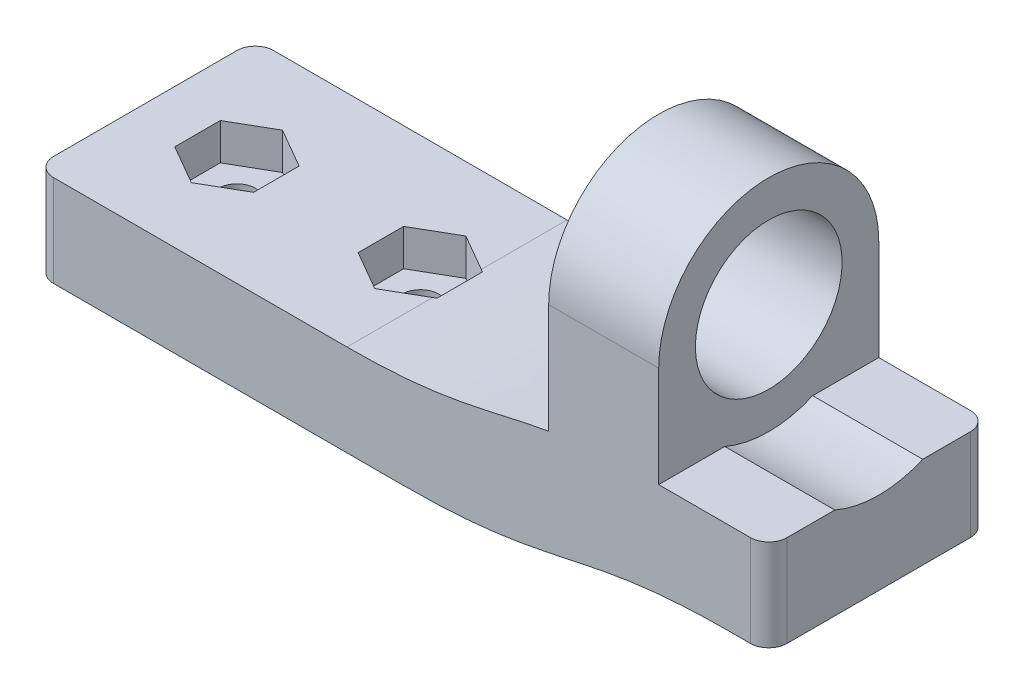
ISO-10303-21;
HEADER;
FILE_DESCRIPTION(('STEP AP214'),'2;1');
FILE_NAME('part.step','',(''),(''),'','','');
FILE_SCHEMA(('AUTOMOTIVE_DESIGN { 1 0 10303 214 1 1 1 1 }'));
ENDSEC;
DATA;
#1=APPLICATION_CONTEXT('core data for automotive mechanical design processes');
#2=APPLICATION_PROTOCOL_DEFINITION('international standard','automotive_design',2000,#1);
#3=PRODUCT_CONTEXT('',#1,'mechanical');
#4=PRODUCT('Part','Part','',(#3));
#5=PRODUCT_RELATED_PRODUCT_CATEGORY('part','',(#4));
#6=PRODUCT_DEFINITION_FORMATION('','',#4);
#7=PRODUCT_DEFINITION_CONTEXT('part definition',#1,'design');
#8=PRODUCT_DEFINITION('design','',#6,#7);
#9=PRODUCT_DEFINITION_SHAPE('','',#8);
#10=(LENGTH_UNIT() NAMED_UNIT(*) SI_UNIT(.MILLI.,.METRE.));
#11=(NAMED_UNIT(*) PLANE_ANGLE_UNIT() SI_UNIT($,.RADIAN.));
#12=(NAMED_UNIT(*) SI_UNIT($,.STERADIAN.) SOLID_ANGLE_UNIT());
#13=UNCERTAINTY_MEASURE_WITH_UNIT(LENGTH_MEASURE(1.E-05),#10,'distance_accuracy_value','');
#14=(GEOMETRIC_REPRESENTATION_CONTEXT(3) GLOBAL_UNCERTAINTY_ASSIGNED_CONTEXT((#13)) GLOBAL_UNIT_ASSIGNED_CONTEXT((#10,
#11,#12)) REPRESENTATION_CONTEXT('',''));
#15=CARTESIAN_POINT('',(0.,0.,0.));
#16=DIRECTION('',(0.,0.,1.));
#17=DIRECTION('',(1.,0.,0.));
#18=AXIS2_PLACEMENT_3D('',#15,#16,#17);
#19=CARTESIAN_POINT('',(0.,5.,12.));
#20=DIRECTION('',(0.,1.,0.));
#21=DIRECTION('',(0.,0.,1.));
#22=AXIS2_PLACEMENT_3D('',#19,#20,#21);
#23=PLANE('',#22);
#24=DIRECTION('',(0.,0.,-1.));
#25=VECTOR('',#24,1.);
#26=CARTESIAN_POINT('',(17.,5.,12.));
#27=LINE('',#26,#25);
#28=CARTESIAN_POINT('',(17.,5.,12.));
#29=VERTEX_POINT('',#28);
#30=CARTESIAN_POINT('',(17.,5.,7.32790561913614));
#31=VERTEX_POINT('',#30);
#32=EDGE_CURVE('E567',#29,#31,#27,.T.);
#33=ORIENTED_EDGE('',*,*,#32,.T.);
#34=DIRECTION('',(-0.866025403784439,0.,0.5));
#35=VECTOR('',#34,1.);
#36=CARTESIAN_POINT('',(2.22692378864669,5.,15.8571451465198));
#37=LINE('',#36,#35);
#38=CARTESIAN_POINT('',(15.,5.,8.48260615751539));
#39=VERTEX_POINT('',#38);
#40=EDGE_CURVE('E347',#31,#39,#37,.T.);
#41=ORIENTED_EDGE('',*,*,#40,.T.);
#42=DIRECTION('',(-0.866025403784439,0.,-0.5));
#43=VECTOR('',#42,1.);
#44=CARTESIAN_POINT('',(5.27307621135332,5.,2.86676408975326));
#45=LINE('',#44,#43);
#46=CARTESIAN_POINT('',(12.85,5.,7.2413030787577));
#47=VERTEX_POINT('',#46);
#48=EDGE_CURVE('E644',#39,#47,#45,.T.);
#49=ORIENTED_EDGE('',*,*,#48,.T.);
#50=DIRECTION('',(0.,0.,-1.));
#51=VECTOR('',#50,1.);
#52=CARTESIAN_POINT('',(12.85,5.,12.));
#53=LINE('',#52,#51);
#54=CARTESIAN_POINT('',(12.85,5.,4.7586969212423));
#55=VERTEX_POINT('',#54);
#56=EDGE_CURVE('E630',#47,#55,#53,.T.);
#57=ORIENTED_EDGE('',*,*,#56,.T.);
#58=DIRECTION('',(0.866025403784439,0.,-0.5));
#59=VECTOR('',#58,1.);
#60=CARTESIAN_POINT('',(0.0769237886466831,5.,12.1332359102467));
#61=LINE('',#60,#59);
#62=CARTESIAN_POINT('',(15.,5.,3.51739384248461));
#63=VERTEX_POINT('',#62);
#64=EDGE_CURVE('E416',#55,#63,#61,.T.);
#65=ORIENTED_EDGE('',*,*,#64,.T.);
#66=DIRECTION('',(0.866025403784439,0.,0.5));
#67=VECTOR('',#66,1.);
#68=CARTESIAN_POINT('',(7.42307621135331,5.,-0.857145146519829));
#69=LINE('',#68,#67);
#70=CARTESIAN_POINT('',(17.,5.,4.67209438086386));
#71=VERTEX_POINT('',#70);
#72=EDGE_CURVE('E344',#63,#71,#69,.T.);
#73=ORIENTED_EDGE('',*,*,#72,.T.);
#74=CARTESIAN_POINT('',(17.,5.,0.));
#75=VERTEX_POINT('',#74);
#76=EDGE_CURVE('E566',#71,#75,#27,.T.);
#77=ORIENTED_EDGE('',*,*,#76,.T.);
#78=DIRECTION('',(1.,0.,0.));
#79=VECTOR('',#78,1.);
#80=CARTESIAN_POINT('',(0.,5.,0.));
#81=LINE('',#80,#79);
#82=CARTESIAN_POINT('',(1.,5.,0.));
#83=VERTEX_POINT('',#82);
#84=EDGE_CURVE('E516',#83,#75,#81,.T.);
#85=ORIENTED_EDGE('',*,*,#84,.F.);
#86=CARTESIAN_POINT('',(1.,5.,1.));
#87=DIRECTION('',(0.,1.,0.));
#88=DIRECTION('',(0.,0.,1.));
#89=AXIS2_PLACEMENT_3D('',#86,#87,#88);
#90=CIRCLE('',#89,1.);
#91=CARTESIAN_POINT('',(0.,5.,1.));
#92=VERTEX_POINT('',#91);
#93=EDGE_CURVE('E583',#83,#92,#90,.T.);
#94=ORIENTED_EDGE('',*,*,#93,.T.);
#95=DIRECTION('',(0.,0.,-1.));
#96=VECTOR('',#95,1.);
#97=CARTESIAN_POINT('',(0.,5.,12.));
#98=LINE('',#97,#96);
#99=CARTESIAN_POINT('',(0.,5.,11.));
#100=VERTEX_POINT('',#99);
#101=EDGE_CURVE('E563',#100,#92,#98,.T.);
#102=ORIENTED_EDGE('',*,*,#101,.F.);
#103=CARTESIAN_POINT('',(1.,5.,11.));
#104=DIRECTION('',(0.,1.,0.));
#105=DIRECTION('',(0.,0.,1.));
#106=AXIS2_PLACEMENT_3D('',#103,#104,#105);
#107=CIRCLE('',#106,1.);
#108=CARTESIAN_POINT('',(1.,5.,12.));
#109=VERTEX_POINT('',#108);
#110=EDGE_CURVE('E585',#100,#109,#107,.T.);
#111=ORIENTED_EDGE('',*,*,#110,.T.);
#112=DIRECTION('',(1.,0.,0.));
#113=VECTOR('',#112,1.);
#114=CARTESIAN_POINT('',(0.,5.,12.));
#115=LINE('',#114,#113);
#116=EDGE_CURVE('E381',#109,#29,#115,.T.);
#117=ORIENTED_EDGE('',*,*,#116,.T.);
#118=EDGE_LOOP('',(#33,#41,#49,#57,#65,#73,#77,#85,#94,#102,#111,#117));
#119=FACE_BOUND('',#118,.T.);
#120=DIRECTION('',(0.866025403784439,0.,-0.5));
#121=VECTOR('',#120,1.);
#122=CARTESIAN_POINT('',(-2.42307621135332,5.,7.80310889132455));
#123=LINE('',#122,#121);
#124=CARTESIAN_POINT('',(2.84999999999999,5.,4.7586969212423));
#125=VERTEX_POINT('',#124);
#126=CARTESIAN_POINT('',(4.99999999999999,5.,3.51739384248461));
#127=VERTEX_POINT('',#126);
#128=EDGE_CURVE('E84',#125,#127,#123,.T.);
#129=ORIENTED_EDGE('',*,*,#128,.T.);
#130=DIRECTION('',(0.866025403784439,0.,0.5));
#131=VECTOR('',#130,1.);
#132=CARTESIAN_POINT('',(4.92307621135331,5.,3.47298187240236));
#133=LINE('',#132,#131);
#134=CARTESIAN_POINT('',(7.14999999999999,5.,4.7586969212423));
#135=VERTEX_POINT('',#134);
#136=EDGE_CURVE('E12',#127,#135,#133,.T.);
#137=ORIENTED_EDGE('',*,*,#136,.T.);
#138=DIRECTION('',(0.,0.,1.));
#139=VECTOR('',#138,1.);
#140=CARTESIAN_POINT('',(7.14999999999999,5.,12.));
#141=LINE('',#140,#139);
#142=CARTESIAN_POINT('',(7.14999999999999,5.,7.2413030787577));
#143=VERTEX_POINT('',#142);
#144=EDGE_CURVE('E645',#135,#143,#141,.T.);
#145=ORIENTED_EDGE('',*,*,#144,.T.);
#146=DIRECTION('',(-0.866025403784439,0.,0.5));
#147=VECTOR('',#146,1.);
#148=CARTESIAN_POINT('',(-0.273076211353319,5.,11.5270181275976));
#149=LINE('',#148,#147);
#150=CARTESIAN_POINT('',(4.99999999999999,5.,8.48260615751539));
#151=VERTEX_POINT('',#150);
#152=EDGE_CURVE('E652',#143,#151,#149,.T.);
#153=ORIENTED_EDGE('',*,*,#152,.T.);
#154=DIRECTION('',(-0.866025403784439,0.,-0.5));
#155=VECTOR('',#154,1.);
#156=CARTESIAN_POINT('',(2.77307621135331,5.,7.19689110867545));
#157=LINE('',#156,#155);
#158=CARTESIAN_POINT('',(2.84999999999999,5.,7.24130307875769));
#159=VERTEX_POINT('',#158);
#160=EDGE_CURVE('E655',#151,#159,#157,.T.);
#161=ORIENTED_EDGE('',*,*,#160,.T.);
#162=DIRECTION('',(0.,0.,-1.));
#163=VECTOR('',#162,1.);
#164=CARTESIAN_POINT('',(2.84999999999999,5.,12.));
#165=LINE('',#164,#163);
#166=EDGE_CURVE('E658',#159,#125,#165,.T.);
#167=ORIENTED_EDGE('',*,*,#166,.T.);
#168=EDGE_LOOP('',(#129,#137,#145,#153,#161,#167));
#169=FACE_BOUND('',#168,.T.);
#170=ADVANCED_FACE('F76',(#119,#169),#23,.T.);
#171=CARTESIAN_POINT('',(4.99999999999999,18.5,6.));
#172=DIRECTION('',(0.,-1.,0.));
#173=DIRECTION('',(0.,0.,-1.));
#174=AXIS2_PLACEMENT_3D('',#171,#172,#173);
#175=CYLINDRICAL_SURFACE('',#174,1.);
#176=CARTESIAN_POINT('',(4.99999999999999,0.,6.));
#177=DIRECTION('',(0.,1.,0.));
#178=DIRECTION('',(0.,0.,1.));
#179=AXIS2_PLACEMENT_3D('',#176,#177,#178);
#180=CIRCLE('',#179,1.);
#181=CARTESIAN_POINT('',(4.99999999999999,0.,7.));
#182=VERTEX_POINT('',#181);
#183=EDGE_CURVE('E359',#182,#182,#180,.T.);
#184=ORIENTED_EDGE('',*,*,#183,.F.);
#185=EDGE_LOOP('',(#184));
#186=FACE_BOUND('',#185,.T.);
#187=CARTESIAN_POINT('',(4.99999999999999,3.,6.));
#188=DIRECTION('',(0.,1.,0.));
#189=DIRECTION('',(0.,0.,1.));
#190=AXIS2_PLACEMENT_3D('',#187,#188,#189);
#191=CIRCLE('',#190,1.);
#192=CARTESIAN_POINT('',(4.99999999999999,3.,7.));
#193=VERTEX_POINT('',#192);
#194=EDGE_CURVE('E282',#193,#193,#191,.T.);
#195=ORIENTED_EDGE('',*,*,#194,.T.);
#196=EDGE_LOOP('',(#195));
#197=FACE_BOUND('',#196,.T.);
#198=ADVANCED_FACE('F394',(#186,#197),#175,.F.);
#199=CARTESIAN_POINT('',(17.,5.,12.));
#200=CARTESIAN_POINT('',(25.0493754757197,5.,12.));
#201=CARTESIAN_POINT('',(25.9184813701822,7.,12.));
#202=CARTESIAN_POINT('',(34.,7.,12.));
#203=B_SPLINE_CURVE_WITH_KNOTS('',3,(#199,#200,#201,#202),.UNSPECIFIED.,.F.,.F.,(4,4),(0.,1.),.UNSPECIFIED.);
#204=DIRECTION('',(0.,0.,-1.));
#205=VECTOR('',#204,1.);
#206=SURFACE_OF_LINEAR_EXTRUSION('',#203,#205);
#207=DIRECTION('',(0.,0.,-1.));
#208=VECTOR('',#207,1.);
#209=CARTESIAN_POINT('',(17.15,5.00023312428814,12.));
#210=LINE('',#209,#208);
#211=CARTESIAN_POINT('',(17.15,5.00023312428814,4.7586969212423));
#212=VERTEX_POINT('',#211);
#213=CARTESIAN_POINT('',(17.15,5.00023312428814,7.2413030787577));
#214=VERTEX_POINT('',#213);
#215=EDGE_CURVE('E417',#212,#214,#210,.F.);
#216=ORIENTED_EDGE('',*,*,#215,.T.);
#217=CARTESIAN_POINT('',(17.15,5.00023312428814,7.2413030787577));
#218=CARTESIAN_POINT('',(17.1250000454464,5.00015528123822,7.25573680924894));
#219=CARTESIAN_POINT('',(17.1000000681696,5.00009693268925,7.27017055285943));
#220=CARTESIAN_POINT('',(17.0500000681696,5.00001922459321,7.29903806631891));
#221=CARTESIAN_POINT('',(17.0250000454464,4.99999986504613,7.3134718361679));
#222=CARTESIAN_POINT('',(17.,5.,7.32790561913614));
#223=B_SPLINE_CURVE_WITH_KNOTS('',3,(#217,#218,#219,#220,#221,#222),.UNSPECIFIED.,.F.,.F.,(4,2,
4),(0.,0.0866026385686826,0.173205277137368),.UNSPECIFIED.);
#224=EDGE_CURVE('E409',#214,#31,#223,.T.);
#225=ORIENTED_EDGE('',*,*,#224,.T.);
#226=ORIENTED_EDGE('',*,*,#32,.F.);
#227=CARTESIAN_POINT('',(28.,6.51917525637421,12.));
#228=VERTEX_POINT('',#227);
#229=EDGE_CURVE('E375',#29,#228,#203,.T.);
#230=ORIENTED_EDGE('',*,*,#229,.T.);
#231=DIRECTION('',(0.,0.,-1.));
#232=VECTOR('',#231,1.);
#233=CARTESIAN_POINT('',(28.,6.51917525637421,12.));
#234=LINE('',#233,#232);
#235=CARTESIAN_POINT('',(28.,6.51917525637421,0.));
#236=VERTEX_POINT('',#235);
#237=EDGE_CURVE('E511',#228,#236,#234,.T.);
#238=ORIENTED_EDGE('',*,*,#237,.T.);
#239=CARTESIAN_POINT('',(17.,5.,0.));
#240=CARTESIAN_POINT('',(25.0493754757197,5.,0.));
#241=CARTESIAN_POINT('',(25.9184813701822,7.,0.));
#242=CARTESIAN_POINT('',(34.,7.,0.));
#243=B_SPLINE_CURVE_WITH_KNOTS('',3,(#239,#240,#241,#242),.UNSPECIFIED.,.F.,.F.,(4,4),(0.,1.),.UNSPECIFIED.);
#244=EDGE_CURVE('E374',#75,#236,#243,.T.);
#245=ORIENTED_EDGE('',*,*,#244,.F.);
#246=ORIENTED_EDGE('',*,*,#76,.F.);
#247=CARTESIAN_POINT('',(17.,5.,4.67209438086386));
#248=CARTESIAN_POINT('',(17.0250000454464,4.99999986504613,4.6865281638321));
#249=CARTESIAN_POINT('',(17.0500000681696,5.0000192245932,4.70096193368109));
#250=CARTESIAN_POINT('',(17.1000000681696,5.00009693268925,4.72982944714057));
#251=CARTESIAN_POINT('',(17.1250000454464,5.00015528123822,4.74426319075106));
#252=CARTESIAN_POINT('',(17.15,5.00023312428814,4.7586969212423));
#253=B_SPLINE_CURVE_WITH_KNOTS('',3,(#247,#248,#249,#250,#251,#252),.UNSPECIFIED.,.F.,.F.,(4,2,
4),(0.,0.0866026385686851,0.173205277137369),.UNSPECIFIED.);
#254=EDGE_CURVE('E401',#71,#212,#253,.T.);
#255=ORIENTED_EDGE('',*,*,#254,.T.);
#256=EDGE_LOOP('',(#216,#225,#226,#230,#238,#245,#246,#255));
#257=FACE_BOUND('',#256,.T.);
#258=ADVANCED_FACE('F388',(#257),#206,.T.);
#259=CARTESIAN_POINT('',(15.,18.5,6.));
#260=DIRECTION('',(0.,-1.,0.));
#261=DIRECTION('',(0.,0.,-1.));
#262=AXIS2_PLACEMENT_3D('',#259,#260,#261);
#263=CYLINDRICAL_SURFACE('',#262,1.);
#264=CARTESIAN_POINT('',(15.,0.,6.));
#265=DIRECTION('',(0.,1.,0.));
#266=DIRECTION('',(0.,0.,1.));
#267=AXIS2_PLACEMENT_3D('',#264,#265,#266);
#268=CIRCLE('',#267,1.);
#269=CARTESIAN_POINT('',(15.,0.,7.));
#270=VERTEX_POINT('',#269);
#271=EDGE_CURVE('E362',#270,#270,#268,.T.);
#272=ORIENTED_EDGE('',*,*,#271,.F.);
#273=EDGE_LOOP('',(#272));
#274=FACE_BOUND('',#273,.T.);
#275=CARTESIAN_POINT('',(15.,3.,6.));
#276=DIRECTION('',(0.,1.,0.));
#277=DIRECTION('',(0.,0.,1.));
#278=AXIS2_PLACEMENT_3D('',#275,#276,#277);
#279=CIRCLE('',#278,1.);
#280=CARTESIAN_POINT('',(15.,3.,7.));
#281=VERTEX_POINT('',#280);
#282=EDGE_CURVE('E343',#281,#281,#279,.T.);
#283=ORIENTED_EDGE('',*,*,#282,.T.);
#284=EDGE_LOOP('',(#283));
#285=FACE_BOUND('',#284,.T.);
#286=ADVANCED_FACE('F393',(#274,#285),#263,.F.);
#287=CARTESIAN_POINT('',(40.,0.,12.));
#288=DIRECTION('',(-1.,0.,0.));
#289=DIRECTION('',(0.,0.,1.));
#290=AXIS2_PLACEMENT_3D('',#287,#288,#289);
#291=PLANE('',#290);
#292=CARTESIAN_POINT('',(40.,12.5,6.));
#293=DIRECTION('',(-1.,0.,0.));
#294=DIRECTION('',(0.,0.,1.));
#295=AXIS2_PLACEMENT_3D('',#292,#293,#294);
#296=CIRCLE('',#295,6.00000000000001);
#297=CARTESIAN_POINT('',(40.,7.,8.39791576165632));
#298=VERTEX_POINT('',#297);
#299=CARTESIAN_POINT('',(40.,7.00000000000001,3.60208423834367));
#300=VERTEX_POINT('',#299);
#301=EDGE_CURVE('E355',#298,#300,#296,.F.);
#302=ORIENTED_EDGE('',*,*,#301,.F.);
#303=DIRECTION('',(0.,0.,-1.));
#304=VECTOR('',#303,1.);
#305=CARTESIAN_POINT('',(40.,7.,12.));
#306=LINE('',#305,#304);
#307=CARTESIAN_POINT('',(40.,7.,11.));
#308=VERTEX_POINT('',#307);
#309=EDGE_CURVE('E548',#308,#298,#306,.T.);
#310=ORIENTED_EDGE('',*,*,#309,.F.);
#311=DIRECTION('',(0.,1.,0.));
#312=VECTOR('',#311,1.);
#313=CARTESIAN_POINT('',(40.,2.,11.));
#314=LINE('',#313,#312);
#315=CARTESIAN_POINT('',(40.,2.,11.));
#316=VERTEX_POINT('',#315);
#317=EDGE_CURVE('E608',#308,#316,#314,.F.);
#318=ORIENTED_EDGE('',*,*,#317,.T.);
#319=DIRECTION('',(0.,0.,-1.));
#320=VECTOR('',#319,1.);
#321=CARTESIAN_POINT('',(40.,2.,12.));
#322=LINE('',#321,#320);
#323=CARTESIAN_POINT('',(40.,2.,1.));
#324=VERTEX_POINT('',#323);
#325=EDGE_CURVE('E551',#316,#324,#322,.T.);
#326=ORIENTED_EDGE('',*,*,#325,.T.);
#327=DIRECTION('',(0.,1.,0.));
#328=VECTOR('',#327,1.);
#329=CARTESIAN_POINT('',(40.,0.,1.));
#330=LINE('',#329,#328);
#331=CARTESIAN_POINT('',(40.,7.,1.));
#332=VERTEX_POINT('',#331);
#333=EDGE_CURVE('E605',#324,#332,#330,.T.);
#334=ORIENTED_EDGE('',*,*,#333,.T.);
#335=EDGE_CURVE('E547',#300,#332,#306,.T.);
#336=ORIENTED_EDGE('',*,*,#335,.F.);
#337=EDGE_LOOP('',(#302,#310,#318,#326,#334,#336));
#338=FACE_BOUND('',#337,.T.);
#339=ADVANCED_FACE('F447',(#338),#291,.F.);
#340=CARTESIAN_POINT('',(0.,6.99999999999999,12.));
#341=DIRECTION('',(0.,-1.,0.));
#342=DIRECTION('',(1.,0.,0.));
#343=AXIS2_PLACEMENT_3D('',#340,#341,#342);
#344=PLANE('',#343);
#345=DIRECTION('',(-1.,0.,0.));
#346=VECTOR('',#345,1.);
#347=CARTESIAN_POINT('',(44.,7.,8.39791576165633));
#348=LINE('',#347,#346);
#349=CARTESIAN_POINT('',(34.,7.,8.3979157616563));
#350=VERTEX_POINT('',#349);
#351=EDGE_CURVE('E357',#350,#298,#348,.F.);
#352=ORIENTED_EDGE('',*,*,#351,.F.);
#353=DIRECTION('',(0.,0.,-1.));
#354=VECTOR('',#353,1.);
#355=CARTESIAN_POINT('',(34.,7.,12.));
#356=LINE('',#355,#354);
#357=CARTESIAN_POINT('',(34.,7.,12.));
#358=VERTEX_POINT('',#357);
#359=EDGE_CURVE('E544',#358,#350,#356,.T.);
#360=ORIENTED_EDGE('',*,*,#359,.F.);
#361=DIRECTION('',(-1.,0.,0.));
#362=VECTOR('',#361,1.);
#363=CARTESIAN_POINT('',(0.,6.99999999999999,12.));
#364=LINE('',#363,#362);
#365=CARTESIAN_POINT('',(39.,7.,12.));
#366=VERTEX_POINT('',#365);
#367=EDGE_CURVE('E504',#366,#358,#364,.T.);
#368=ORIENTED_EDGE('',*,*,#367,.F.);
#369=CARTESIAN_POINT('',(39.,7.,11.));
#370=DIRECTION('',(0.,-1.,0.));
#371=DIRECTION('',(1.,0.,0.));
#372=AXIS2_PLACEMENT_3D('',#369,#370,#371);
#373=CIRCLE('',#372,1.);
#374=EDGE_CURVE('E603',#366,#308,#373,.F.);
#375=ORIENTED_EDGE('',*,*,#374,.T.);
#376=ORIENTED_EDGE('',*,*,#309,.T.);
#377=EDGE_LOOP('',(#352,#360,#368,#375,#376));
#378=FACE_BOUND('',#377,.T.);
#379=ADVANCED_FACE('F476',(#378),#344,.F.);
#380=DIRECTION('',(-1.,0.,0.));
#381=VECTOR('',#380,1.);
#382=CARTESIAN_POINT('',(44.,7.,3.60208423834367));
#383=LINE('',#382,#381);
#384=CARTESIAN_POINT('',(34.,7.,3.6020842383437));
#385=VERTEX_POINT('',#384);
#386=EDGE_CURVE('E352',#300,#385,#383,.T.);
#387=ORIENTED_EDGE('',*,*,#386,.F.);
#388=ORIENTED_EDGE('',*,*,#335,.T.);
#389=CARTESIAN_POINT('',(39.,7.,1.));
#390=DIRECTION('',(0.,-1.,0.));
#391=DIRECTION('',(1.,0.,0.));
#392=AXIS2_PLACEMENT_3D('',#389,#390,#391);
#393=CIRCLE('',#392,1.);
#394=CARTESIAN_POINT('',(39.,7.,0.));
#395=VERTEX_POINT('',#394);
#396=EDGE_CURVE('E601',#332,#395,#393,.F.);
#397=ORIENTED_EDGE('',*,*,#396,.T.);
#398=DIRECTION('',(-1.,0.,0.));
#399=VECTOR('',#398,1.);
#400=CARTESIAN_POINT('',(0.,6.99999999999999,0.));
#401=LINE('',#400,#399);
#402=CARTESIAN_POINT('',(34.,7.,0.));
#403=VERTEX_POINT('',#402);
#404=EDGE_CURVE('E534',#395,#403,#401,.T.);
#405=ORIENTED_EDGE('',*,*,#404,.T.);
#406=EDGE_CURVE('E543',#385,#403,#356,.T.);
#407=ORIENTED_EDGE('',*,*,#406,.F.);
#408=EDGE_LOOP('',(#387,#388,#397,#405,#407));
#409=FACE_BOUND('',#408,.T.);
#410=ADVANCED_FACE('F479',(#409),#344,.F.);
#411=CARTESIAN_POINT('',(0.,0.,12.));
#412=DIRECTION('',(0.,1.,0.));
#413=DIRECTION('',(0.,0.,1.));
#414=AXIS2_PLACEMENT_3D('',#411,#412,#413);
#415=PLANE('',#414);
#416=ORIENTED_EDGE('',*,*,#271,.T.);
#417=EDGE_LOOP('',(#416));
#418=FACE_BOUND('',#417,.T.);
#419=DIRECTION('',(1.,0.,0.));
#420=VECTOR('',#419,1.);
#421=CARTESIAN_POINT('',(0.,0.,12.));
#422=LINE('',#421,#420);
#423=CARTESIAN_POINT('',(1.,0.,12.));
#424=VERTEX_POINT('',#423);
#425=CARTESIAN_POINT('',(20.,0.,12.));
#426=VERTEX_POINT('',#425);
#427=EDGE_CURVE('E499',#424,#426,#422,.T.);
#428=ORIENTED_EDGE('',*,*,#427,.F.);
#429=CARTESIAN_POINT('',(1.,0.,11.));
#430=DIRECTION('',(0.,1.,0.));
#431=DIRECTION('',(0.,0.,1.));
#432=AXIS2_PLACEMENT_3D('',#429,#430,#431);
#433=CIRCLE('',#432,1.);
#434=CARTESIAN_POINT('',(0.,0.,11.));
#435=VERTEX_POINT('',#434);
#436=EDGE_CURVE('E594',#424,#435,#433,.F.);
#437=ORIENTED_EDGE('',*,*,#436,.T.);
#438=DIRECTION('',(0.,0.,-1.));
#439=VECTOR('',#438,1.);
#440=CARTESIAN_POINT('',(0.,0.,12.));
#441=LINE('',#440,#439);
#442=CARTESIAN_POINT('',(0.,0.,1.));
#443=VERTEX_POINT('',#442);
#444=EDGE_CURVE('E560',#435,#443,#441,.T.);
#445=ORIENTED_EDGE('',*,*,#444,.T.);
#446=CARTESIAN_POINT('',(1.,0.,1.));
#447=DIRECTION('',(0.,1.,0.));
#448=DIRECTION('',(0.,0.,1.));
#449=AXIS2_PLACEMENT_3D('',#446,#447,#448);
#450=CIRCLE('',#449,1.);
#451=CARTESIAN_POINT('',(1.,0.,0.));
#452=VERTEX_POINT('',#451);
#453=EDGE_CURVE('E592',#443,#452,#450,.F.);
#454=ORIENTED_EDGE('',*,*,#453,.T.);
#455=DIRECTION('',(1.,0.,0.));
#456=VECTOR('',#455,1.);
#457=CARTESIAN_POINT('',(0.,0.,0.));
#458=LINE('',#457,#456);
#459=CARTESIAN_POINT('',(20.,0.,0.));
#460=VERTEX_POINT('',#459);
#461=EDGE_CURVE('E522',#452,#460,#458,.T.);
#462=ORIENTED_EDGE('',*,*,#461,.T.);
#463=DIRECTION('',(0.,0.,-1.));
#464=VECTOR('',#463,1.);
#465=CARTESIAN_POINT('',(20.,0.,12.));
#466=LINE('',#465,#464);
#467=EDGE_CURVE('E557',#426,#460,#466,.T.);
#468=ORIENTED_EDGE('',*,*,#467,.F.);
#469=EDGE_LOOP('',(#428,#437,#445,#454,#462,#468));
#470=FACE_BOUND('',#469,.T.);
#471=ORIENTED_EDGE('',*,*,#183,.T.);
#472=EDGE_LOOP('',(#471));
#473=FACE_BOUND('',#472,.T.);
#474=ADVANCED_FACE('F474',(#418,#470,#473),#415,.F.);
#475=CARTESIAN_POINT('',(34.,0.,12.));
#476=DIRECTION('',(-1.,0.,0.));
#477=DIRECTION('',(0.,0.,1.));
#478=AXIS2_PLACEMENT_3D('',#475,#476,#477);
#479=PLANE('',#478);
#480=CARTESIAN_POINT('',(34.,12.5,6.));
#481=DIRECTION('',(-1.,0.,0.));
#482=DIRECTION('',(0.,0.,1.));
#483=AXIS2_PLACEMENT_3D('',#480,#481,#482);
#484=CIRCLE('',#483,6.);
#485=CARTESIAN_POINT('',(34.,12.5,0.));
#486=VERTEX_POINT('',#485);
#487=CARTESIAN_POINT('',(34.,12.5,12.));
#488=VERTEX_POINT('',#487);
#489=EDGE_CURVE('E372',#486,#488,#484,.F.);
#490=ORIENTED_EDGE('',*,*,#489,.T.);
#491=DIRECTION('',(0.,1.,0.));
#492=VECTOR('',#491,1.);
#493=CARTESIAN_POINT('',(34.,0.,12.));
#494=LINE('',#493,#492);
#495=EDGE_CURVE('E506',#358,#488,#494,.T.);
#496=ORIENTED_EDGE('',*,*,#495,.F.);
#497=ORIENTED_EDGE('',*,*,#359,.T.);
#498=CARTESIAN_POINT('',(34.,12.5,6.));
#499=DIRECTION('',(1.,0.,0.));
#500=DIRECTION('',(0.,1.,0.));
#501=AXIS2_PLACEMENT_3D('',#498,#499,#500);
#502=CIRCLE('',#501,6.00000000000001);
#503=EDGE_CURVE('E350',#350,#385,#502,.T.);
#504=ORIENTED_EDGE('',*,*,#503,.T.);
#505=ORIENTED_EDGE('',*,*,#406,.T.);
#506=DIRECTION('',(0.,1.,0.));
#507=VECTOR('',#506,1.);
#508=CARTESIAN_POINT('',(34.,0.,0.));
#509=LINE('',#508,#507);
#510=EDGE_CURVE('E537',#403,#486,#509,.T.);
#511=ORIENTED_EDGE('',*,*,#510,.T.);
#512=EDGE_LOOP('',(#490,#496,#497,#504,#505,#511));
#513=FACE_BOUND('',#512,.T.);
#514=CARTESIAN_POINT('',(34.,12.5,6.));
#515=DIRECTION('',(-1.,0.,0.));
#516=DIRECTION('',(0.,0.,1.));
#517=AXIS2_PLACEMENT_3D('',#514,#515,#516);
#518=CIRCLE('',#517,4.);
#519=CARTESIAN_POINT('',(34.,12.5,10.));
#520=VERTEX_POINT('',#519);
#521=EDGE_CURVE('E366',#520,#520,#518,.F.);
#522=ORIENTED_EDGE('',*,*,#521,.F.);
#523=EDGE_LOOP('',(#522));
#524=FACE_BOUND('',#523,.T.);
#525=ADVANCED_FACE('F470',(#513,#524),#479,.F.);
#526=CARTESIAN_POINT('',(28.,0.,12.));
#527=DIRECTION('',(1.,0.,0.));
#528=DIRECTION('',(0.,1.,0.));
#529=AXIS2_PLACEMENT_3D('',#526,#527,#528);
#530=PLANE('',#529);
#531=DIRECTION('',(0.,-1.,0.));
#532=VECTOR('',#531,1.);
#533=CARTESIAN_POINT('',(28.,0.,12.));
#534=LINE('',#533,#532);
#535=CARTESIAN_POINT('',(28.,12.5,12.));
#536=VERTEX_POINT('',#535);
#537=EDGE_CURVE('E509',#536,#228,#534,.T.);
#538=ORIENTED_EDGE('',*,*,#537,.F.);
#539=CARTESIAN_POINT('',(28.,12.5,6.));
#540=DIRECTION('',(1.,0.,0.));
#541=DIRECTION('',(0.,1.,0.));
#542=AXIS2_PLACEMENT_3D('',#539,#540,#541);
#543=CIRCLE('',#542,6.);
#544=CARTESIAN_POINT('',(28.,12.5,0.));
#545=VERTEX_POINT('',#544);
#546=EDGE_CURVE('E369',#536,#545,#543,.F.);
#547=ORIENTED_EDGE('',*,*,#546,.T.);
#548=DIRECTION('',(0.,-1.,0.));
#549=VECTOR('',#548,1.);
#550=CARTESIAN_POINT('',(28.,0.,0.));
#551=LINE('',#550,#549);
#552=EDGE_CURVE('E382',#545,#236,#551,.T.);
#553=ORIENTED_EDGE('',*,*,#552,.T.);
#554=ORIENTED_EDGE('',*,*,#237,.F.);
#555=EDGE_LOOP('',(#538,#547,#553,#554));
#556=FACE_BOUND('',#555,.T.);
#557=CARTESIAN_POINT('',(28.,12.5,6.));
#558=DIRECTION('',(1.,0.,0.));
#559=DIRECTION('',(0.,1.,0.));
#560=AXIS2_PLACEMENT_3D('',#557,#558,#559);
#561=CIRCLE('',#560,4.);
#562=CARTESIAN_POINT('',(28.,16.5,6.));
#563=VERTEX_POINT('',#562);
#564=EDGE_CURVE('E365',#563,#563,#561,.F.);
#565=ORIENTED_EDGE('',*,*,#564,.F.);
#566=EDGE_LOOP('',(#565));
#567=FACE_BOUND('',#566,.T.);
#568=ADVANCED_FACE('F466',(#556,#567),#530,.F.);
#569=CARTESIAN_POINT('',(0.,0.,12.));
#570=DIRECTION('',(-1.,0.,0.));
#571=DIRECTION('',(0.,0.,1.));
#572=AXIS2_PLACEMENT_3D('',#569,#570,#571);
#573=PLANE('',#572);
#574=ORIENTED_EDGE('',*,*,#444,.F.);
#575=DIRECTION('',(0.,1.,0.));
#576=VECTOR('',#575,1.);
#577=CARTESIAN_POINT('',(0.,0.,11.));
#578=LINE('',#577,#576);
#579=EDGE_CURVE('E580',#435,#100,#578,.T.);
#580=ORIENTED_EDGE('',*,*,#579,.T.);
#581=ORIENTED_EDGE('',*,*,#101,.T.);
#582=DIRECTION('',(0.,1.,0.));
#583=VECTOR('',#582,1.);
#584=CARTESIAN_POINT('',(0.,0.,1.));
#585=LINE('',#584,#583);
#586=EDGE_CURVE('E576',#92,#443,#585,.F.);
#587=ORIENTED_EDGE('',*,*,#586,.T.);
#588=EDGE_LOOP('',(#574,#580,#581,#587));
#589=FACE_BOUND('',#588,.T.);
#590=ADVANCED_FACE('F469',(#589),#573,.T.);
#591=CARTESIAN_POINT('',(20.,0.,12.));
#592=CARTESIAN_POINT('',(28.689683172901,0.,12.));
#593=CARTESIAN_POINT('',(29.3401982415742,2.,12.));
#594=CARTESIAN_POINT('',(38.,2.,12.));
#595=B_SPLINE_CURVE_WITH_KNOTS('',3,(#591,#592,#593,#594),.UNSPECIFIED.,.F.,.F.,(4,4),(0.,1.),.UNSPECIFIED.);
#596=DIRECTION('',(0.,0.,-1.));
#597=VECTOR('',#596,1.);
#598=SURFACE_OF_LINEAR_EXTRUSION('',#595,#597);
#599=CARTESIAN_POINT('',(20.,0.,0.));
#600=CARTESIAN_POINT('',(28.689683172901,0.,0.));
#601=CARTESIAN_POINT('',(29.3401982415742,2.,0.));
#602=CARTESIAN_POINT('',(38.,2.,0.));
#603=B_SPLINE_CURVE_WITH_KNOTS('',3,(#599,#600,#601,#602),.UNSPECIFIED.,.F.,.F.,(4,4),(0.,1.),.UNSPECIFIED.);
#604=CARTESIAN_POINT('',(38.,2.,0.));
#605=VERTEX_POINT('',#604);
#606=EDGE_CURVE('E524',#460,#605,#603,.T.);
#607=ORIENTED_EDGE('',*,*,#606,.T.);
#608=DIRECTION('',(0.,0.,-1.));
#609=VECTOR('',#608,1.);
#610=CARTESIAN_POINT('',(38.,2.,12.));
#611=LINE('',#610,#609);
#612=CARTESIAN_POINT('',(38.,2.,12.));
#613=VERTEX_POINT('',#612);
#614=EDGE_CURVE('E554',#613,#605,#611,.T.);
#615=ORIENTED_EDGE('',*,*,#614,.F.);
#616=EDGE_CURVE('E492',#426,#613,#595,.T.);
#617=ORIENTED_EDGE('',*,*,#616,.F.);
#618=ORIENTED_EDGE('',*,*,#467,.T.);
#619=EDGE_LOOP('',(#607,#615,#617,#618));
#620=FACE_BOUND('',#619,.T.);
#621=ADVANCED_FACE('F486',(#620),#598,.F.);
#622=CARTESIAN_POINT('',(0.,1.99999999999999,12.));
#623=DIRECTION('',(0.,-1.,0.));
#624=DIRECTION('',(1.,0.,0.));
#625=AXIS2_PLACEMENT_3D('',#622,#623,#624);
#626=PLANE('',#625);
#627=ORIENTED_EDGE('',*,*,#325,.F.);
#628=CARTESIAN_POINT('',(39.,2.,11.));
#629=DIRECTION('',(0.,-1.,0.));
#630=DIRECTION('',(1.,0.,0.));
#631=AXIS2_PLACEMENT_3D('',#628,#629,#630);
#632=CIRCLE('',#631,1.);
#633=CARTESIAN_POINT('',(39.,2.,12.));
#634=VERTEX_POINT('',#633);
#635=EDGE_CURVE('E612',#316,#634,#632,.T.);
#636=ORIENTED_EDGE('',*,*,#635,.T.);
#637=DIRECTION('',(-1.,0.,0.));
#638=VECTOR('',#637,1.);
#639=CARTESIAN_POINT('',(0.,1.99999999999999,12.));
#640=LINE('',#639,#638);
#641=EDGE_CURVE('E498',#634,#613,#640,.T.);
#642=ORIENTED_EDGE('',*,*,#641,.T.);
#643=ORIENTED_EDGE('',*,*,#614,.T.);
#644=DIRECTION('',(-1.,0.,0.));
#645=VECTOR('',#644,1.);
#646=CARTESIAN_POINT('',(0.,1.99999999999999,0.));
#647=LINE('',#646,#645);
#648=CARTESIAN_POINT('',(39.,2.,0.));
#649=VERTEX_POINT('',#648);
#650=EDGE_CURVE('E529',#649,#605,#647,.T.);
#651=ORIENTED_EDGE('',*,*,#650,.F.);
#652=CARTESIAN_POINT('',(39.,2.,1.));
#653=DIRECTION('',(0.,-1.,0.));
#654=DIRECTION('',(1.,0.,0.));
#655=AXIS2_PLACEMENT_3D('',#652,#653,#654);
#656=CIRCLE('',#655,1.);
#657=EDGE_CURVE('E610',#649,#324,#656,.T.);
#658=ORIENTED_EDGE('',*,*,#657,.T.);
#659=EDGE_LOOP('',(#627,#636,#642,#643,#651,#658));
#660=FACE_BOUND('',#659,.T.);
#661=ADVANCED_FACE('F461',(#660),#626,.T.);
#662=CARTESIAN_POINT('',(0.,0.,12.));
#663=DIRECTION('',(0.,0.,1.));
#664=DIRECTION('',(1.,0.,0.));
#665=AXIS2_PLACEMENT_3D('',#662,#663,#664);
#666=PLANE('',#665);
#667=ORIENTED_EDGE('',*,*,#116,.F.);
#668=DIRECTION('',(0.,1.,0.));
#669=VECTOR('',#668,1.);
#670=CARTESIAN_POINT('',(1.,0.,12.));
#671=LINE('',#670,#669);
#672=EDGE_CURVE('E590',#109,#424,#671,.F.);
#673=ORIENTED_EDGE('',*,*,#672,.T.);
#674=ORIENTED_EDGE('',*,*,#427,.T.);
#675=ORIENTED_EDGE('',*,*,#616,.T.);
#676=ORIENTED_EDGE('',*,*,#641,.F.);
#677=DIRECTION('',(0.,1.,0.));
#678=VECTOR('',#677,1.);
#679=CARTESIAN_POINT('',(39.,7.,12.));
#680=LINE('',#679,#678);
#681=EDGE_CURVE('E587',#634,#366,#680,.T.);
#682=ORIENTED_EDGE('',*,*,#681,.T.);
#683=ORIENTED_EDGE('',*,*,#367,.T.);
#684=ORIENTED_EDGE('',*,*,#495,.T.);
#685=DIRECTION('',(-1.,0.,0.));
#686=VECTOR('',#685,1.);
#687=CARTESIAN_POINT('',(40.,12.5,12.));
#688=LINE('',#687,#686);
#689=EDGE_CURVE('E573',#536,#488,#688,.F.);
#690=ORIENTED_EDGE('',*,*,#689,.F.);
#691=ORIENTED_EDGE('',*,*,#537,.T.);
#692=ORIENTED_EDGE('',*,*,#229,.F.);
#693=EDGE_LOOP('',(#667,#673,#674,#675,#676,#682,#683,#684,#690,#691,#692));
#694=FACE_BOUND('',#693,.T.);
#695=ADVANCED_FACE('F458',(#694),#666,.T.);
#696=CARTESIAN_POINT('',(0.,0.,0.));
#697=DIRECTION('',(0.,0.,1.));
#698=DIRECTION('',(1.,0.,0.));
#699=AXIS2_PLACEMENT_3D('',#696,#697,#698);
#700=PLANE('',#699);
#701=ORIENTED_EDGE('',*,*,#461,.F.);
#702=DIRECTION('',(0.,1.,0.));
#703=VECTOR('',#702,1.);
#704=CARTESIAN_POINT('',(1.,5.,0.));
#705=LINE('',#704,#703);
#706=EDGE_CURVE('E598',#452,#83,#705,.T.);
#707=ORIENTED_EDGE('',*,*,#706,.T.);
#708=ORIENTED_EDGE('',*,*,#84,.T.);
#709=ORIENTED_EDGE('',*,*,#244,.T.);
#710=ORIENTED_EDGE('',*,*,#552,.F.);
#711=DIRECTION('',(-1.,0.,0.));
#712=VECTOR('',#711,1.);
#713=CARTESIAN_POINT('',(40.,12.5,0.));
#714=LINE('',#713,#712);
#715=EDGE_CURVE('E570',#545,#486,#714,.F.);
#716=ORIENTED_EDGE('',*,*,#715,.T.);
#717=ORIENTED_EDGE('',*,*,#510,.F.);
#718=ORIENTED_EDGE('',*,*,#404,.F.);
#719=DIRECTION('',(0.,1.,0.));
#720=VECTOR('',#719,1.);
#721=CARTESIAN_POINT('',(39.,0.,0.));
#722=LINE('',#721,#720);
#723=EDGE_CURVE('E596',#395,#649,#722,.F.);
#724=ORIENTED_EDGE('',*,*,#723,.T.);
#725=ORIENTED_EDGE('',*,*,#650,.T.);
#726=ORIENTED_EDGE('',*,*,#606,.F.);
#727=EDGE_LOOP('',(#701,#707,#708,#709,#710,#716,#717,#718,#724,#725,#726));
#728=FACE_BOUND('',#727,.T.);
#729=ADVANCED_FACE('F456',(#728),#700,.F.);
#730=CARTESIAN_POINT('',(40.,12.5,6.));
#731=DIRECTION('',(-1.,0.,0.));
#732=DIRECTION('',(0.,0.,1.));
#733=AXIS2_PLACEMENT_3D('',#730,#731,#732);
#734=CYLINDRICAL_SURFACE('',#733,6.);
#735=ORIENTED_EDGE('',*,*,#715,.F.);
#736=ORIENTED_EDGE('',*,*,#546,.F.);
#737=ORIENTED_EDGE('',*,*,#689,.T.);
#738=ORIENTED_EDGE('',*,*,#489,.F.);
#739=EDGE_LOOP('',(#735,#736,#737,#738));
#740=FACE_BOUND('',#739,.T.);
#741=ADVANCED_FACE('F452',(#740),#734,.T.);
#742=CARTESIAN_POINT('',(40.,12.5,6.));
#743=DIRECTION('',(-1.,0.,0.));
#744=DIRECTION('',(0.,0.,1.));
#745=AXIS2_PLACEMENT_3D('',#742,#743,#744);
#746=CYLINDRICAL_SURFACE('',#745,4.);
#747=ORIENTED_EDGE('',*,*,#564,.T.);
#748=EDGE_LOOP('',(#747));
#749=FACE_BOUND('',#748,.T.);
#750=ORIENTED_EDGE('',*,*,#521,.T.);
#751=EDGE_LOOP('',(#750));
#752=FACE_BOUND('',#751,.T.);
#753=ADVANCED_FACE('F449',(#749,#752),#746,.F.);
#754=CARTESIAN_POINT('',(1.,0.,11.));
#755=DIRECTION('',(0.,1.,0.));
#756=DIRECTION('',(0.,0.,1.));
#757=AXIS2_PLACEMENT_3D('',#754,#755,#756);
#758=CYLINDRICAL_SURFACE('',#757,1.);
#759=ORIENTED_EDGE('',*,*,#436,.F.);
#760=ORIENTED_EDGE('',*,*,#672,.F.);
#761=ORIENTED_EDGE('',*,*,#110,.F.);
#762=ORIENTED_EDGE('',*,*,#579,.F.);
#763=EDGE_LOOP('',(#759,#760,#761,#762));
#764=FACE_BOUND('',#763,.T.);
#765=ADVANCED_FACE('F397',(#764),#758,.T.);
#766=CARTESIAN_POINT('',(1.,0.,1.));
#767=DIRECTION('',(0.,-1.,0.));
#768=DIRECTION('',(0.,0.,-1.));
#769=AXIS2_PLACEMENT_3D('',#766,#767,#768);
#770=CYLINDRICAL_SURFACE('',#769,1.);
#771=ORIENTED_EDGE('',*,*,#453,.F.);
#772=ORIENTED_EDGE('',*,*,#586,.F.);
#773=ORIENTED_EDGE('',*,*,#93,.F.);
#774=ORIENTED_EDGE('',*,*,#706,.F.);
#775=EDGE_LOOP('',(#771,#772,#773,#774));
#776=FACE_BOUND('',#775,.T.);
#777=ADVANCED_FACE('F762',(#776),#770,.T.);
#778=CARTESIAN_POINT('',(39.,0.,11.));
#779=DIRECTION('',(0.,-1.,0.));
#780=DIRECTION('',(0.,0.,-1.));
#781=AXIS2_PLACEMENT_3D('',#778,#779,#780);
#782=CYLINDRICAL_SURFACE('',#781,1.);
#783=ORIENTED_EDGE('',*,*,#635,.F.);
#784=ORIENTED_EDGE('',*,*,#317,.F.);
#785=ORIENTED_EDGE('',*,*,#374,.F.);
#786=ORIENTED_EDGE('',*,*,#681,.F.);
#787=EDGE_LOOP('',(#783,#784,#785,#786));
#788=FACE_BOUND('',#787,.T.);
#789=ADVANCED_FACE('F769',(#788),#782,.T.);
#790=CARTESIAN_POINT('',(39.,0.,1.));
#791=DIRECTION('',(0.,1.,0.));
#792=DIRECTION('',(0.,0.,1.));
#793=AXIS2_PLACEMENT_3D('',#790,#791,#792);
#794=CYLINDRICAL_SURFACE('',#793,1.);
#795=ORIENTED_EDGE('',*,*,#657,.F.);
#796=ORIENTED_EDGE('',*,*,#723,.F.);
#797=ORIENTED_EDGE('',*,*,#396,.F.);
#798=ORIENTED_EDGE('',*,*,#333,.F.);
#799=EDGE_LOOP('',(#795,#796,#797,#798));
#800=FACE_BOUND('',#799,.T.);
#801=ADVANCED_FACE('F78',(#800),#794,.T.);
#802=CARTESIAN_POINT('',(44.,12.5,6.));
#803=DIRECTION('',(-1.,0.,0.));
#804=DIRECTION('',(0.,-1.,0.));
#805=AXIS2_PLACEMENT_3D('',#802,#803,#804);
#806=CYLINDRICAL_SURFACE('',#805,6.00000000000001);
#807=ORIENTED_EDGE('',*,*,#351,.T.);
#808=ORIENTED_EDGE('',*,*,#301,.T.);
#809=ORIENTED_EDGE('',*,*,#386,.T.);
#810=ORIENTED_EDGE('',*,*,#503,.F.);
#811=EDGE_LOOP('',(#807,#808,#809,#810));
#812=FACE_BOUND('',#811,.T.);
#813=ADVANCED_FACE('F437',(#812),#806,.F.);
#814=CARTESIAN_POINT('',(15.,6.,3.51739384248461));
#815=DIRECTION('',(0.5,0.,0.866025403784439));
#816=DIRECTION('',(0.866025403784439,0.,-0.5));
#817=AXIS2_PLACEMENT_3D('',#814,#815,#816);
#818=PLANE('',#817);
#819=DIRECTION('',(0.,-1.,0.));
#820=VECTOR('',#819,1.);
#821=CARTESIAN_POINT('',(12.85,6.,4.7586969212423));
#822=LINE('',#821,#820);
#823=CARTESIAN_POINT('',(12.85,3.,4.7586969212423));
#824=VERTEX_POINT('',#823);
#825=EDGE_CURVE('E341',#55,#824,#822,.T.);
#826=ORIENTED_EDGE('',*,*,#825,.T.);
#827=DIRECTION('',(-0.866025403784439,0.,0.5));
#828=VECTOR('',#827,1.);
#829=CARTESIAN_POINT('',(15.,3.,3.51739384248461));
#830=LINE('',#829,#828);
#831=CARTESIAN_POINT('',(15.,3.,3.51739384248461));
#832=VERTEX_POINT('',#831);
#833=EDGE_CURVE('E314',#832,#824,#830,.T.);
#834=ORIENTED_EDGE('',*,*,#833,.F.);
#835=DIRECTION('',(0.,-1.,0.));
#836=VECTOR('',#835,1.);
#837=CARTESIAN_POINT('',(15.,6.,3.51739384248461));
#838=LINE('',#837,#836);
#839=EDGE_CURVE('E332',#63,#832,#838,.T.);
#840=ORIENTED_EDGE('',*,*,#839,.F.);
#841=ORIENTED_EDGE('',*,*,#64,.F.);
#842=EDGE_LOOP('',(#826,#834,#840,#841));
#843=FACE_BOUND('',#842,.T.);
#844=ADVANCED_FACE('F433',(#843),#818,.T.);
#845=CARTESIAN_POINT('',(12.85,6.,4.7586969212423));
#846=DIRECTION('',(1.,0.,0.));
#847=DIRECTION('',(0.,0.,-1.));
#848=AXIS2_PLACEMENT_3D('',#845,#846,#847);
#849=PLANE('',#848);
#850=DIRECTION('',(0.,-1.,0.));
#851=VECTOR('',#850,1.);
#852=CARTESIAN_POINT('',(12.85,6.,7.2413030787577));
#853=LINE('',#852,#851);
#854=CARTESIAN_POINT('',(12.85,3.,7.2413030787577));
#855=VERTEX_POINT('',#854);
#856=EDGE_CURVE('E339',#47,#855,#853,.T.);
#857=ORIENTED_EDGE('',*,*,#856,.T.);
#858=DIRECTION('',(0.,0.,1.));
#859=VECTOR('',#858,1.);
#860=CARTESIAN_POINT('',(12.85,3.,4.7586969212423));
#861=LINE('',#860,#859);
#862=EDGE_CURVE('E317',#824,#855,#861,.T.);
#863=ORIENTED_EDGE('',*,*,#862,.F.);
#864=ORIENTED_EDGE('',*,*,#825,.F.);
#865=ORIENTED_EDGE('',*,*,#56,.F.);
#866=EDGE_LOOP('',(#857,#863,#864,#865));
#867=FACE_BOUND('',#866,.T.);
#868=ADVANCED_FACE('F429',(#867),#849,.T.);
#869=CARTESIAN_POINT('',(12.85,6.,7.2413030787577));
#870=DIRECTION('',(0.5,0.,-0.866025403784439));
#871=DIRECTION('',(-0.866025403784439,0.,-0.5));
#872=AXIS2_PLACEMENT_3D('',#869,#870,#871);
#873=PLANE('',#872);
#874=DIRECTION('',(0.,-1.,0.));
#875=VECTOR('',#874,1.);
#876=CARTESIAN_POINT('',(15.,6.,8.48260615751539));
#877=LINE('',#876,#875);
#878=CARTESIAN_POINT('',(15.,3.,8.48260615751539));
#879=VERTEX_POINT('',#878);
#880=EDGE_CURVE('E337',#39,#879,#877,.T.);
#881=ORIENTED_EDGE('',*,*,#880,.T.);
#882=DIRECTION('',(0.866025403784438,0.,0.5));
#883=VECTOR('',#882,1.);
#884=CARTESIAN_POINT('',(12.85,3.,7.2413030787577));
#885=LINE('',#884,#883);
#886=EDGE_CURVE('E320',#855,#879,#885,.T.);
#887=ORIENTED_EDGE('',*,*,#886,.F.);
#888=ORIENTED_EDGE('',*,*,#856,.F.);
#889=ORIENTED_EDGE('',*,*,#48,.F.);
#890=EDGE_LOOP('',(#881,#887,#888,#889));
#891=FACE_BOUND('',#890,.T.);
#892=ADVANCED_FACE('F425',(#891),#873,.T.);
#893=CARTESIAN_POINT('',(15.,6.,8.48260615751539));
#894=DIRECTION('',(-0.5,0.,-0.866025403784439));
#895=DIRECTION('',(-0.866025403784439,0.,0.5));
#896=AXIS2_PLACEMENT_3D('',#893,#894,#895);
#897=PLANE('',#896);
#898=ORIENTED_EDGE('',*,*,#224,.F.);
#899=DIRECTION('',(0.,-1.,0.));
#900=VECTOR('',#899,1.);
#901=CARTESIAN_POINT('',(17.15,6.,7.2413030787577));
#902=LINE('',#901,#900);
#903=CARTESIAN_POINT('',(17.15,3.,7.2413030787577));
#904=VERTEX_POINT('',#903);
#905=EDGE_CURVE('E335',#214,#904,#902,.T.);
#906=ORIENTED_EDGE('',*,*,#905,.T.);
#907=DIRECTION('',(0.866025403784438,0.,-0.5));
#908=VECTOR('',#907,1.);
#909=CARTESIAN_POINT('',(15.,3.,8.48260615751539));
#910=LINE('',#909,#908);
#911=EDGE_CURVE('E323',#879,#904,#910,.T.);
#912=ORIENTED_EDGE('',*,*,#911,.F.);
#913=ORIENTED_EDGE('',*,*,#880,.F.);
#914=ORIENTED_EDGE('',*,*,#40,.F.);
#915=EDGE_LOOP('',(#898,#906,#912,#913,#914));
#916=FACE_BOUND('',#915,.T.);
#917=ADVANCED_FACE('F419',(#916),#897,.T.);
#918=CARTESIAN_POINT('',(17.15,6.,7.2413030787577));
#919=DIRECTION('',(-1.,0.,0.));
#920=DIRECTION('',(0.,0.,1.));
#921=AXIS2_PLACEMENT_3D('',#918,#919,#920);
#922=PLANE('',#921);
#923=DIRECTION('',(0.,-1.,0.));
#924=VECTOR('',#923,1.);
#925=CARTESIAN_POINT('',(17.15,6.,4.7586969212423));
#926=LINE('',#925,#924);
#927=CARTESIAN_POINT('',(17.15,3.,4.7586969212423));
#928=VERTEX_POINT('',#927);
#929=EDGE_CURVE('E99',#212,#928,#926,.T.);
#930=ORIENTED_EDGE('',*,*,#929,.T.);
#931=DIRECTION('',(0.,0.,-1.));
#932=VECTOR('',#931,1.);
#933=CARTESIAN_POINT('',(17.15,3.,7.2413030787577));
#934=LINE('',#933,#932);
#935=EDGE_CURVE('E326',#904,#928,#934,.T.);
#936=ORIENTED_EDGE('',*,*,#935,.F.);
#937=ORIENTED_EDGE('',*,*,#905,.F.);
#938=ORIENTED_EDGE('',*,*,#215,.F.);
#939=EDGE_LOOP('',(#930,#936,#937,#938));
#940=FACE_BOUND('',#939,.T.);
#941=ADVANCED_FACE('F424',(#940),#922,.T.);
#942=CARTESIAN_POINT('',(17.15,6.,4.7586969212423));
#943=DIRECTION('',(-0.5,0.,0.866025403784439));
#944=DIRECTION('',(0.866025403784439,0.,0.5));
#945=AXIS2_PLACEMENT_3D('',#942,#943,#944);
#946=PLANE('',#945);
#947=ORIENTED_EDGE('',*,*,#839,.T.);
#948=DIRECTION('',(-0.866025403784439,0.,-0.5));
#949=VECTOR('',#948,1.);
#950=CARTESIAN_POINT('',(17.15,3.,4.7586969212423));
#951=LINE('',#950,#949);
#952=EDGE_CURVE('E329',#928,#832,#951,.T.);
#953=ORIENTED_EDGE('',*,*,#952,.F.);
#954=ORIENTED_EDGE('',*,*,#929,.F.);
#955=ORIENTED_EDGE('',*,*,#254,.F.);
#956=ORIENTED_EDGE('',*,*,#72,.F.);
#957=EDGE_LOOP('',(#947,#953,#954,#955,#956));
#958=FACE_BOUND('',#957,.T.);
#959=ADVANCED_FACE('F620',(#958),#946,.T.);
#960=CARTESIAN_POINT('',(0.,3.,0.));
#961=DIRECTION('',(0.,1.,0.));
#962=DIRECTION('',(0.,0.,1.));
#963=AXIS2_PLACEMENT_3D('',#960,#961,#962);
#964=PLANE('',#963);
#965=ORIENTED_EDGE('',*,*,#282,.F.);
#966=EDGE_LOOP('',(#965));
#967=FACE_BOUND('',#966,.T.);
#968=ORIENTED_EDGE('',*,*,#833,.T.);
#969=ORIENTED_EDGE('',*,*,#862,.T.);
#970=ORIENTED_EDGE('',*,*,#886,.T.);
#971=ORIENTED_EDGE('',*,*,#911,.T.);
#972=ORIENTED_EDGE('',*,*,#935,.T.);
#973=ORIENTED_EDGE('',*,*,#952,.T.);
#974=EDGE_LOOP('',(#968,#969,#970,#971,#972,#973));
#975=FACE_BOUND('',#974,.T.);
#976=ADVANCED_FACE('F617',(#967,#975),#964,.T.);
#977=CARTESIAN_POINT('',(7.14999999999999,6.,4.7586969212423));
#978=DIRECTION('',(-0.5,0.,0.866025403784439));
#979=DIRECTION('',(0.866025403784439,0.,0.5));
#980=AXIS2_PLACEMENT_3D('',#977,#978,#979);
#981=PLANE('',#980);
#982=DIRECTION('',(0.,-1.,0.));
#983=VECTOR('',#982,1.);
#984=CARTESIAN_POINT('',(4.99999999999999,6.,3.51739384248461));
#985=LINE('',#984,#983);
#986=CARTESIAN_POINT('',(4.99999999999999,3.,3.51739384248461));
#987=VERTEX_POINT('',#986);
#988=EDGE_CURVE('E273',#127,#987,#985,.T.);
#989=ORIENTED_EDGE('',*,*,#988,.T.);
#990=DIRECTION('',(-0.866025403784439,0.,-0.5));
#991=VECTOR('',#990,1.);
#992=CARTESIAN_POINT('',(7.14999999999999,3.,4.7586969212423));
#993=LINE('',#992,#991);
#994=CARTESIAN_POINT('',(7.14999999999999,3.,4.7586969212423));
#995=VERTEX_POINT('',#994);
#996=EDGE_CURVE('E278',#995,#987,#993,.T.);
#997=ORIENTED_EDGE('',*,*,#996,.F.);
#998=DIRECTION('',(0.,-1.,0.));
#999=VECTOR('',#998,1.);
#1000=CARTESIAN_POINT('',(7.14999999999999,6.,4.7586969212423));
#1001=LINE('',#1000,#999);
#1002=EDGE_CURVE('E306',#135,#995,#1001,.T.);
#1003=ORIENTED_EDGE('',*,*,#1002,.F.);
#1004=ORIENTED_EDGE('',*,*,#136,.F.);
#1005=EDGE_LOOP('',(#989,#997,#1003,#1004));
#1006=FACE_BOUND('',#1005,.T.);
#1007=ADVANCED_FACE('F275',(#1006),#981,.T.);
#1008=CARTESIAN_POINT('',(4.99999999999999,6.,3.51739384248461));
#1009=DIRECTION('',(0.5,0.,0.866025403784439));
#1010=DIRECTION('',(0.866025403784439,0.,-0.5));
#1011=AXIS2_PLACEMENT_3D('',#1008,#1009,#1010);
#1012=PLANE('',#1011);
#1013=DIRECTION('',(0.,-1.,0.));
#1014=VECTOR('',#1013,1.);
#1015=CARTESIAN_POINT('',(2.84999999999999,6.,4.7586969212423));
#1016=LINE('',#1015,#1014);
#1017=CARTESIAN_POINT('',(2.84999999999999,3.,4.7586969212423));
#1018=VERTEX_POINT('',#1017);
#1019=EDGE_CURVE('E283',#125,#1018,#1016,.T.);
#1020=ORIENTED_EDGE('',*,*,#1019,.T.);
#1021=DIRECTION('',(-0.866025403784439,0.,0.5));
#1022=VECTOR('',#1021,1.);
#1023=CARTESIAN_POINT('',(4.99999999999999,3.,3.51739384248461));
#1024=LINE('',#1023,#1022);
#1025=EDGE_CURVE('E286',#987,#1018,#1024,.T.);
#1026=ORIENTED_EDGE('',*,*,#1025,.F.);
#1027=ORIENTED_EDGE('',*,*,#988,.F.);
#1028=ORIENTED_EDGE('',*,*,#128,.F.);
#1029=EDGE_LOOP('',(#1020,#1026,#1027,#1028));
#1030=FACE_BOUND('',#1029,.T.);
#1031=ADVANCED_FACE('F287',(#1030),#1012,.T.);
#1032=CARTESIAN_POINT('',(2.84999999999999,6.,4.7586969212423));
#1033=DIRECTION('',(1.,0.,0.));
#1034=DIRECTION('',(0.,0.,-1.));
#1035=AXIS2_PLACEMENT_3D('',#1032,#1033,#1034);
#1036=PLANE('',#1035);
#1037=DIRECTION('',(0.,-1.,0.));
#1038=VECTOR('',#1037,1.);
#1039=CARTESIAN_POINT('',(2.84999999999999,6.,7.24130307875769));
#1040=LINE('',#1039,#1038);
#1041=CARTESIAN_POINT('',(2.84999999999999,3.,7.24130307875769));
#1042=VERTEX_POINT('',#1041);
#1043=EDGE_CURVE('E311',#159,#1042,#1040,.T.);
#1044=ORIENTED_EDGE('',*,*,#1043,.T.);
#1045=DIRECTION('',(0.,0.,1.));
#1046=VECTOR('',#1045,1.);
#1047=CARTESIAN_POINT('',(2.84999999999999,3.,4.7586969212423));
#1048=LINE('',#1047,#1046);
#1049=EDGE_CURVE('E292',#1018,#1042,#1048,.T.);
#1050=ORIENTED_EDGE('',*,*,#1049,.F.);
#1051=ORIENTED_EDGE('',*,*,#1019,.F.);
#1052=ORIENTED_EDGE('',*,*,#166,.F.);
#1053=EDGE_LOOP('',(#1044,#1050,#1051,#1052));
#1054=FACE_BOUND('',#1053,.T.);
#1055=ADVANCED_FACE('F661',(#1054),#1036,.T.);
#1056=CARTESIAN_POINT('',(2.84999999999999,6.,7.24130307875769));
#1057=DIRECTION('',(0.5,0.,-0.866025403784439));
#1058=DIRECTION('',(-0.866025403784439,0.,-0.5));
#1059=AXIS2_PLACEMENT_3D('',#1056,#1057,#1058);
#1060=PLANE('',#1059);
#1061=DIRECTION('',(0.,-1.,0.));
#1062=VECTOR('',#1061,1.);
#1063=CARTESIAN_POINT('',(4.99999999999999,6.,8.48260615751539));
#1064=LINE('',#1063,#1062);
#1065=CARTESIAN_POINT('',(4.99999999999999,3.,8.48260615751539));
#1066=VERTEX_POINT('',#1065);
#1067=EDGE_CURVE('E309',#151,#1066,#1064,.T.);
#1068=ORIENTED_EDGE('',*,*,#1067,.T.);
#1069=DIRECTION('',(0.866025403784439,0.,0.5));
#1070=VECTOR('',#1069,1.);
#1071=CARTESIAN_POINT('',(2.84999999999999,3.,7.24130307875769));
#1072=LINE('',#1071,#1070);
#1073=EDGE_CURVE('E300',#1042,#1066,#1072,.T.);
#1074=ORIENTED_EDGE('',*,*,#1073,.F.);
#1075=ORIENTED_EDGE('',*,*,#1043,.F.);
#1076=ORIENTED_EDGE('',*,*,#160,.F.);
#1077=EDGE_LOOP('',(#1068,#1074,#1075,#1076));
#1078=FACE_BOUND('',#1077,.T.);
#1079=ADVANCED_FACE('F666',(#1078),#1060,.T.);
#1080=CARTESIAN_POINT('',(4.99999999999999,6.,8.48260615751539));
#1081=DIRECTION('',(-0.5,0.,-0.866025403784439));
#1082=DIRECTION('',(-0.866025403784439,0.,0.5));
#1083=AXIS2_PLACEMENT_3D('',#1080,#1081,#1082);
#1084=PLANE('',#1083);
#1085=DIRECTION('',(0.,-1.,0.));
#1086=VECTOR('',#1085,1.);
#1087=CARTESIAN_POINT('',(7.14999999999999,6.,7.2413030787577));
#1088=LINE('',#1087,#1086);
#1089=CARTESIAN_POINT('',(7.14999999999999,3.,7.2413030787577));
#1090=VERTEX_POINT('',#1089);
#1091=EDGE_CURVE('E91',#143,#1090,#1088,.T.);
#1092=ORIENTED_EDGE('',*,*,#1091,.T.);
#1093=DIRECTION('',(0.866025403784439,0.,-0.5));
#1094=VECTOR('',#1093,1.);
#1095=CARTESIAN_POINT('',(4.99999999999999,3.,8.48260615751539));
#1096=LINE('',#1095,#1094);
#1097=EDGE_CURVE('E303',#1066,#1090,#1096,.T.);
#1098=ORIENTED_EDGE('',*,*,#1097,.F.);
#1099=ORIENTED_EDGE('',*,*,#1067,.F.);
#1100=ORIENTED_EDGE('',*,*,#152,.F.);
#1101=EDGE_LOOP('',(#1092,#1098,#1099,#1100));
#1102=FACE_BOUND('',#1101,.T.);
#1103=ADVANCED_FACE('F669',(#1102),#1084,.T.);
#1104=CARTESIAN_POINT('',(7.14999999999999,6.,7.2413030787577));
#1105=DIRECTION('',(-1.,0.,0.));
#1106=DIRECTION('',(0.,0.,1.));
#1107=AXIS2_PLACEMENT_3D('',#1104,#1105,#1106);
#1108=PLANE('',#1107);
#1109=ORIENTED_EDGE('',*,*,#1002,.T.);
#1110=DIRECTION('',(0.,0.,-1.));
#1111=VECTOR('',#1110,1.);
#1112=CARTESIAN_POINT('',(7.14999999999999,3.,7.2413030787577));
#1113=LINE('',#1112,#1111);
#1114=EDGE_CURVE('E296',#1090,#995,#1113,.T.);
#1115=ORIENTED_EDGE('',*,*,#1114,.F.);
#1116=ORIENTED_EDGE('',*,*,#1091,.F.);
#1117=ORIENTED_EDGE('',*,*,#144,.F.);
#1118=EDGE_LOOP('',(#1109,#1115,#1116,#1117));
#1119=FACE_BOUND('',#1118,.T.);
#1120=ADVANCED_FACE('F670',(#1119),#1108,.T.);
#1121=CARTESIAN_POINT('',(0.,3.,0.));
#1122=DIRECTION('',(0.,1.,0.));
#1123=DIRECTION('',(0.,0.,1.));
#1124=AXIS2_PLACEMENT_3D('',#1121,#1122,#1123);
#1125=PLANE('',#1124);
#1126=ORIENTED_EDGE('',*,*,#194,.F.);
#1127=EDGE_LOOP('',(#1126));
#1128=FACE_BOUND('',#1127,.T.);
#1129=ORIENTED_EDGE('',*,*,#996,.T.);
#1130=ORIENTED_EDGE('',*,*,#1025,.T.);
#1131=ORIENTED_EDGE('',*,*,#1049,.T.);
#1132=ORIENTED_EDGE('',*,*,#1073,.T.);
#1133=ORIENTED_EDGE('',*,*,#1097,.T.);
#1134=ORIENTED_EDGE('',*,*,#1114,.T.);
#1135=EDGE_LOOP('',(#1129,#1130,#1131,#1132,#1133,#1134));
#1136=FACE_BOUND('',#1135,.T.);
#1137=ADVANCED_FACE('F294',(#1128,#1136),#1125,.T.);
#1138=CLOSED_SHELL('',(#170,#198,#258,#286,#339,#379,#410,#474,#525,#568,#590,#621,#661,#695,
#729,#741,#753,#765,#777,#789,#801,#813,#844,#868,#892,#917,#941,#959,#976,#1007,#1031,#1055,
#1079,#1103,#1120,#1137));
#1139=MANIFOLD_SOLID_BREP('B2',#1138);
#1140=ADVANCED_BREP_SHAPE_REPRESENTATION('',(#18,#1139),#14);
#1141=SHAPE_DEFINITION_REPRESENTATION(#9,#1140);
ENDSEC;
END-ISO-10303-21;
